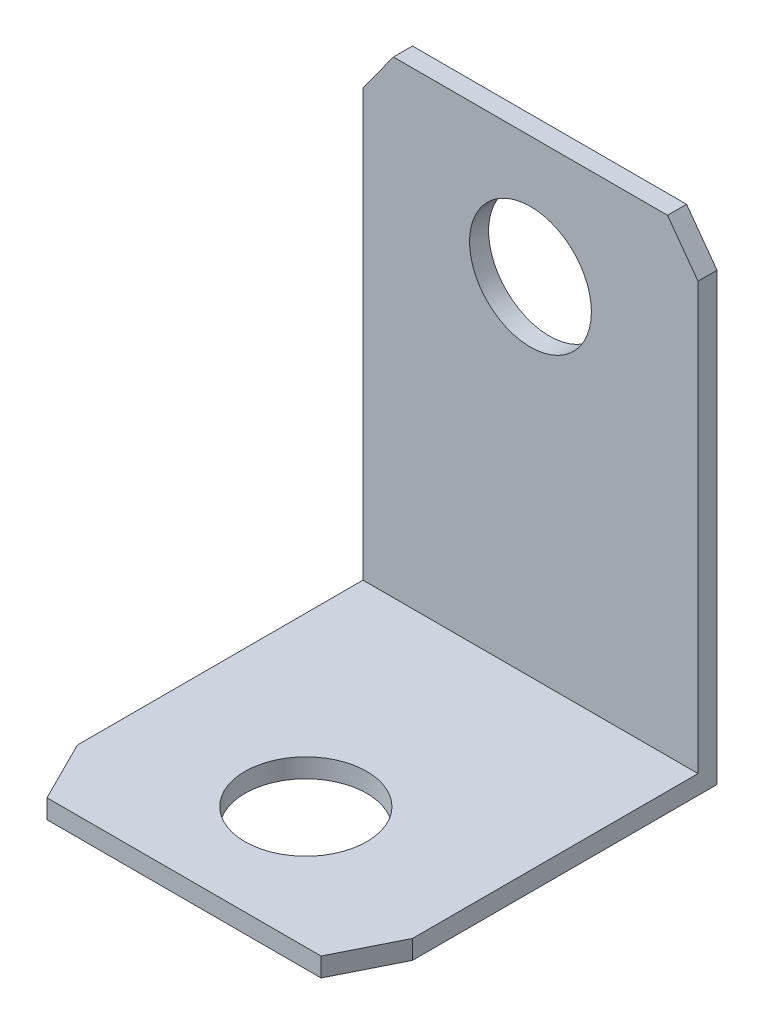
ISO-10303-21;
HEADER;
FILE_DESCRIPTION(('STEP AP214'),'2;1');
FILE_NAME('part.step','',(''),(''),'','','');
FILE_SCHEMA(('AUTOMOTIVE_DESIGN { 1 0 10303 214 1 1 1 1 }'));
ENDSEC;
DATA;
#1=APPLICATION_CONTEXT('core data for automotive mechanical design processes');
#2=APPLICATION_PROTOCOL_DEFINITION('international standard','automotive_design',2000,#1);
#3=PRODUCT_CONTEXT('',#1,'mechanical');
#4=PRODUCT('Part','Part','',(#3));
#5=PRODUCT_RELATED_PRODUCT_CATEGORY('part','',(#4));
#6=PRODUCT_DEFINITION_FORMATION('','',#4);
#7=PRODUCT_DEFINITION_CONTEXT('part definition',#1,'design');
#8=PRODUCT_DEFINITION('design','',#6,#7);
#9=PRODUCT_DEFINITION_SHAPE('','',#8);
#10=(LENGTH_UNIT() NAMED_UNIT(*) SI_UNIT(.MILLI.,.METRE.));
#11=(NAMED_UNIT(*) PLANE_ANGLE_UNIT() SI_UNIT($,.RADIAN.));
#12=(NAMED_UNIT(*) SI_UNIT($,.STERADIAN.) SOLID_ANGLE_UNIT());
#13=UNCERTAINTY_MEASURE_WITH_UNIT(LENGTH_MEASURE(1.E-05),#10,'distance_accuracy_value','');
#14=(GEOMETRIC_REPRESENTATION_CONTEXT(3) GLOBAL_UNCERTAINTY_ASSIGNED_CONTEXT((#13)) GLOBAL_UNIT_ASSIGNED_CONTEXT((#10,
#11,#12)) REPRESENTATION_CONTEXT('',''));
#15=CARTESIAN_POINT('',(0.,0.,0.));
#16=DIRECTION('',(0.,0.,1.));
#17=DIRECTION('',(1.,0.,0.));
#18=AXIS2_PLACEMENT_3D('',#15,#16,#17);
#19=CARTESIAN_POINT('',(0.,1.984375,0.));
#20=DIRECTION('',(0.,-1.,0.));
#21=DIRECTION('',(0.,0.,-1.));
#22=AXIS2_PLACEMENT_3D('',#19,#20,#21);
#23=PLANE('',#22);
#24=CARTESIAN_POINT('',(17.4625,1.984375,25.4));
#25=DIRECTION('',(0.,1.,0.));
#26=DIRECTION('',(0.,0.,1.));
#27=AXIS2_PLACEMENT_3D('',#24,#25,#26);
#28=CIRCLE('',#27,6.35);
#29=CARTESIAN_POINT('',(17.4625,1.984375,31.75));
#30=VERTEX_POINT('',#29);
#31=EDGE_CURVE('E189',#30,#30,#28,.T.);
#32=ORIENTED_EDGE('',*,*,#31,.F.);
#33=EDGE_LOOP('',(#32));
#34=FACE_BOUND('',#33,.T.);
#35=DIRECTION('',(1.,0.,0.));
#36=VECTOR('',#35,1.);
#37=CARTESIAN_POINT('',(34.925,1.984375,1.984375));
#38=LINE('',#37,#36);
#39=CARTESIAN_POINT('',(0.,1.984375,1.984375));
#40=VERTEX_POINT('',#39);
#41=CARTESIAN_POINT('',(34.925,1.984375,1.984375));
#42=VERTEX_POINT('',#41);
#43=EDGE_CURVE('E59',#40,#42,#38,.T.);
#44=ORIENTED_EDGE('',*,*,#43,.F.);
#45=DIRECTION('',(0.,0.,1.));
#46=VECTOR('',#45,1.);
#47=CARTESIAN_POINT('',(0.,1.984375,31.75));
#48=LINE('',#47,#46);
#49=CARTESIAN_POINT('',(0.,1.984375,31.75));
#50=VERTEX_POINT('',#49);
#51=EDGE_CURVE('E98',#40,#50,#48,.T.);
#52=ORIENTED_EDGE('',*,*,#51,.T.);
#53=DIRECTION('',(0.447213595499958,0.,0.894427190999916));
#54=VECTOR('',#53,1.);
#55=CARTESIAN_POINT('',(3.175,1.984375,38.1));
#56=LINE('',#55,#54);
#57=CARTESIAN_POINT('',(3.175,1.984375,38.1));
#58=VERTEX_POINT('',#57);
#59=EDGE_CURVE('E199',#50,#58,#56,.T.);
#60=ORIENTED_EDGE('',*,*,#59,.T.);
#61=DIRECTION('',(1.,0.,0.));
#62=VECTOR('',#61,1.);
#63=CARTESIAN_POINT('',(31.75,1.984375,38.1));
#64=LINE('',#63,#62);
#65=CARTESIAN_POINT('',(31.75,1.984375,38.1));
#66=VERTEX_POINT('',#65);
#67=EDGE_CURVE('E202',#58,#66,#64,.T.);
#68=ORIENTED_EDGE('',*,*,#67,.T.);
#69=DIRECTION('',(0.447213595499958,0.,-0.894427190999916));
#70=VECTOR('',#69,1.);
#71=CARTESIAN_POINT('',(34.925,1.984375,31.75));
#72=LINE('',#71,#70);
#73=CARTESIAN_POINT('',(34.925,1.984375,31.75));
#74=VERTEX_POINT('',#73);
#75=EDGE_CURVE('E66',#66,#74,#72,.T.);
#76=ORIENTED_EDGE('',*,*,#75,.T.);
#77=DIRECTION('',(0.,0.,-1.));
#78=VECTOR('',#77,1.);
#79=CARTESIAN_POINT('',(34.925,1.984375,0.));
#80=LINE('',#79,#78);
#81=EDGE_CURVE('E125',#74,#42,#80,.T.);
#82=ORIENTED_EDGE('',*,*,#81,.T.);
#83=EDGE_LOOP('',(#44,#52,#60,#68,#76,#82));
#84=FACE_BOUND('',#83,.T.);
#85=ADVANCED_FACE('F43',(#34,#84),#23,.F.);
#86=CARTESIAN_POINT('',(0.,0.,0.));
#87=DIRECTION('',(0.,-1.,0.));
#88=DIRECTION('',(0.,0.,-1.));
#89=AXIS2_PLACEMENT_3D('',#86,#87,#88);
#90=PLANE('',#89);
#91=DIRECTION('',(0.,0.,1.));
#92=VECTOR('',#91,1.);
#93=CARTESIAN_POINT('',(0.,0.,31.75));
#94=LINE('',#93,#92);
#95=CARTESIAN_POINT('',(0.,0.,0.));
#96=VERTEX_POINT('',#95);
#97=CARTESIAN_POINT('',(0.,0.,31.75));
#98=VERTEX_POINT('',#97);
#99=EDGE_CURVE('E193',#96,#98,#94,.T.);
#100=ORIENTED_EDGE('',*,*,#99,.F.);
#101=DIRECTION('',(-1.,0.,0.));
#102=VECTOR('',#101,1.);
#103=CARTESIAN_POINT('',(0.,0.,0.));
#104=LINE('',#103,#102);
#105=CARTESIAN_POINT('',(34.925,0.,0.));
#106=VERTEX_POINT('',#105);
#107=EDGE_CURVE('E94',#106,#96,#104,.T.);
#108=ORIENTED_EDGE('',*,*,#107,.F.);
#109=DIRECTION('',(0.,0.,-1.));
#110=VECTOR('',#109,1.);
#111=CARTESIAN_POINT('',(34.925,0.,0.));
#112=LINE('',#111,#110);
#113=CARTESIAN_POINT('',(34.925,0.,31.75));
#114=VERTEX_POINT('',#113);
#115=EDGE_CURVE('E219',#114,#106,#112,.T.);
#116=ORIENTED_EDGE('',*,*,#115,.F.);
#117=DIRECTION('',(0.447213595499958,0.,-0.894427190999916));
#118=VECTOR('',#117,1.);
#119=CARTESIAN_POINT('',(34.925,0.,31.75));
#120=LINE('',#119,#118);
#121=CARTESIAN_POINT('',(31.75,0.,38.1));
#122=VERTEX_POINT('',#121);
#123=EDGE_CURVE('E216',#122,#114,#120,.T.);
#124=ORIENTED_EDGE('',*,*,#123,.F.);
#125=DIRECTION('',(1.,0.,0.));
#126=VECTOR('',#125,1.);
#127=CARTESIAN_POINT('',(31.75,0.,38.1));
#128=LINE('',#127,#126);
#129=CARTESIAN_POINT('',(3.175,0.,38.1));
#130=VERTEX_POINT('',#129);
#131=EDGE_CURVE('E213',#130,#122,#128,.T.);
#132=ORIENTED_EDGE('',*,*,#131,.F.);
#133=DIRECTION('',(0.447213595499958,0.,0.894427190999916));
#134=VECTOR('',#133,1.);
#135=CARTESIAN_POINT('',(3.175,0.,38.1));
#136=LINE('',#135,#134);
#137=EDGE_CURVE('E210',#98,#130,#136,.T.);
#138=ORIENTED_EDGE('',*,*,#137,.F.);
#139=EDGE_LOOP('',(#100,#108,#116,#124,#132,#138));
#140=FACE_BOUND('',#139,.T.);
#141=CARTESIAN_POINT('',(17.4625,0.,25.4));
#142=DIRECTION('',(0.,1.,0.));
#143=DIRECTION('',(0.,0.,1.));
#144=AXIS2_PLACEMENT_3D('',#141,#142,#143);
#145=CIRCLE('',#144,6.35);
#146=CARTESIAN_POINT('',(17.4625,0.,31.75));
#147=VERTEX_POINT('',#146);
#148=EDGE_CURVE('E188',#147,#147,#145,.T.);
#149=ORIENTED_EDGE('',*,*,#148,.T.);
#150=EDGE_LOOP('',(#149));
#151=FACE_BOUND('',#150,.T.);
#152=ADVANCED_FACE('F247',(#140,#151),#90,.T.);
#153=CARTESIAN_POINT('',(0.,1.984375,31.75));
#154=DIRECTION('',(1.,0.,0.));
#155=DIRECTION('',(0.,0.,-1.));
#156=AXIS2_PLACEMENT_3D('',#153,#154,#155);
#157=PLANE('',#156);
#158=ORIENTED_EDGE('',*,*,#99,.T.);
#159=DIRECTION('',(0.,-1.,0.));
#160=VECTOR('',#159,1.);
#161=CARTESIAN_POINT('',(0.,1.984375,31.75));
#162=LINE('',#161,#160);
#163=EDGE_CURVE('E11',#50,#98,#162,.T.);
#164=ORIENTED_EDGE('',*,*,#163,.F.);
#165=ORIENTED_EDGE('',*,*,#51,.F.);
#166=DIRECTION('',(0.,-1.,0.));
#167=VECTOR('',#166,1.);
#168=CARTESIAN_POINT('',(0.,1.984375,1.984375));
#169=LINE('',#168,#167);
#170=CARTESIAN_POINT('',(0.,46.434375,1.984375));
#171=VERTEX_POINT('',#170);
#172=EDGE_CURVE('E146',#171,#40,#169,.T.);
#173=ORIENTED_EDGE('',*,*,#172,.F.);
#174=DIRECTION('',(0.,0.,-1.));
#175=VECTOR('',#174,1.);
#176=CARTESIAN_POINT('',(0.,46.434375,1.984375));
#177=LINE('',#176,#175);
#178=CARTESIAN_POINT('',(0.,46.434375,0.));
#179=VERTEX_POINT('',#178);
#180=EDGE_CURVE('E168',#171,#179,#177,.T.);
#181=ORIENTED_EDGE('',*,*,#180,.T.);
#182=DIRECTION('',(0.,-1.,0.));
#183=VECTOR('',#182,1.);
#184=CARTESIAN_POINT('',(0.,1.984375,0.));
#185=LINE('',#184,#183);
#186=EDGE_CURVE('E130',#179,#96,#185,.T.);
#187=ORIENTED_EDGE('',*,*,#186,.T.);
#188=EDGE_LOOP('',(#158,#164,#165,#173,#181,#187));
#189=FACE_BOUND('',#188,.T.);
#190=ADVANCED_FACE('F45',(#189),#157,.F.);
#191=CARTESIAN_POINT('',(3.175,1.984375,38.1));
#192=DIRECTION('',(0.894427190999916,0.,-0.447213595499958));
#193=DIRECTION('',(-0.447213595499958,0.,-0.894427190999916));
#194=AXIS2_PLACEMENT_3D('',#191,#192,#193);
#195=PLANE('',#194);
#196=ORIENTED_EDGE('',*,*,#137,.T.);
#197=DIRECTION('',(0.,-1.,0.));
#198=VECTOR('',#197,1.);
#199=CARTESIAN_POINT('',(3.175,1.984375,38.1));
#200=LINE('',#199,#198);
#201=EDGE_CURVE('E52',#58,#130,#200,.T.);
#202=ORIENTED_EDGE('',*,*,#201,.F.);
#203=ORIENTED_EDGE('',*,*,#59,.F.);
#204=ORIENTED_EDGE('',*,*,#163,.T.);
#205=EDGE_LOOP('',(#196,#202,#203,#204));
#206=FACE_BOUND('',#205,.T.);
#207=ADVANCED_FACE('F296',(#206),#195,.F.);
#208=CARTESIAN_POINT('',(31.75,1.984375,38.1));
#209=DIRECTION('',(0.,0.,-1.));
#210=DIRECTION('',(-1.,0.,0.));
#211=AXIS2_PLACEMENT_3D('',#208,#209,#210);
#212=PLANE('',#211);
#213=ORIENTED_EDGE('',*,*,#131,.T.);
#214=DIRECTION('',(0.,-1.,0.));
#215=VECTOR('',#214,1.);
#216=CARTESIAN_POINT('',(31.75,1.984375,38.1));
#217=LINE('',#216,#215);
#218=EDGE_CURVE('E232',#66,#122,#217,.T.);
#219=ORIENTED_EDGE('',*,*,#218,.F.);
#220=ORIENTED_EDGE('',*,*,#67,.F.);
#221=ORIENTED_EDGE('',*,*,#201,.T.);
#222=EDGE_LOOP('',(#213,#219,#220,#221));
#223=FACE_BOUND('',#222,.T.);
#224=ADVANCED_FACE('F241',(#223),#212,.F.);
#225=CARTESIAN_POINT('',(34.925,1.984375,31.75));
#226=DIRECTION('',(-0.894427190999916,0.,-0.447213595499958));
#227=DIRECTION('',(-0.447213595499958,0.,0.894427190999916));
#228=AXIS2_PLACEMENT_3D('',#225,#226,#227);
#229=PLANE('',#228);
#230=ORIENTED_EDGE('',*,*,#123,.T.);
#231=DIRECTION('',(0.,-1.,0.));
#232=VECTOR('',#231,1.);
#233=CARTESIAN_POINT('',(34.925,1.984375,31.75));
#234=LINE('',#233,#232);
#235=EDGE_CURVE('E229',#74,#114,#234,.T.);
#236=ORIENTED_EDGE('',*,*,#235,.F.);
#237=ORIENTED_EDGE('',*,*,#75,.F.);
#238=ORIENTED_EDGE('',*,*,#218,.T.);
#239=EDGE_LOOP('',(#230,#236,#237,#238));
#240=FACE_BOUND('',#239,.T.);
#241=ADVANCED_FACE('F251',(#240),#229,.F.);
#242=CARTESIAN_POINT('',(34.925,1.984375,0.));
#243=DIRECTION('',(-1.,0.,0.));
#244=DIRECTION('',(0.,0.,1.));
#245=AXIS2_PLACEMENT_3D('',#242,#243,#244);
#246=PLANE('',#245);
#247=ORIENTED_EDGE('',*,*,#115,.T.);
#248=DIRECTION('',(0.,-1.,0.));
#249=VECTOR('',#248,1.);
#250=CARTESIAN_POINT('',(34.925,1.984375,0.));
#251=LINE('',#250,#249);
#252=CARTESIAN_POINT('',(34.925,46.434375,0.));
#253=VERTEX_POINT('',#252);
#254=EDGE_CURVE('E226',#253,#106,#251,.T.);
#255=ORIENTED_EDGE('',*,*,#254,.F.);
#256=DIRECTION('',(0.,0.,-1.));
#257=VECTOR('',#256,1.);
#258=CARTESIAN_POINT('',(34.925,46.434375,1.984375));
#259=LINE('',#258,#257);
#260=CARTESIAN_POINT('',(34.925,46.434375,1.984375));
#261=VERTEX_POINT('',#260);
#262=EDGE_CURVE('E136',#261,#253,#259,.T.);
#263=ORIENTED_EDGE('',*,*,#262,.F.);
#264=DIRECTION('',(0.,1.,0.));
#265=VECTOR('',#264,1.);
#266=CARTESIAN_POINT('',(34.925,46.434375,1.984375));
#267=LINE('',#266,#265);
#268=EDGE_CURVE('E133',#42,#261,#267,.T.);
#269=ORIENTED_EDGE('',*,*,#268,.F.);
#270=ORIENTED_EDGE('',*,*,#81,.F.);
#271=ORIENTED_EDGE('',*,*,#235,.T.);
#272=EDGE_LOOP('',(#247,#255,#263,#269,#270,#271));
#273=FACE_BOUND('',#272,.T.);
#274=ADVANCED_FACE('F134',(#273),#246,.F.);
#275=CARTESIAN_POINT('',(0.,1.984375,0.));
#276=DIRECTION('',(0.,0.,1.));
#277=DIRECTION('',(1.,0.,0.));
#278=AXIS2_PLACEMENT_3D('',#275,#276,#277);
#279=PLANE('',#278);
#280=ORIENTED_EDGE('',*,*,#107,.T.);
#281=ORIENTED_EDGE('',*,*,#186,.F.);
#282=DIRECTION('',(-0.588171697675047,-0.808736084303188,0.));
#283=VECTOR('',#282,1.);
#284=CARTESIAN_POINT('',(0.,46.434375,0.));
#285=LINE('',#284,#283);
#286=CARTESIAN_POINT('',(3.175,50.8,0.));
#287=VERTEX_POINT('',#286);
#288=EDGE_CURVE('E148',#287,#179,#285,.T.);
#289=ORIENTED_EDGE('',*,*,#288,.F.);
#290=DIRECTION('',(-1.,0.,0.));
#291=VECTOR('',#290,1.);
#292=CARTESIAN_POINT('',(3.175,50.8,0.));
#293=LINE('',#292,#291);
#294=CARTESIAN_POINT('',(31.75,50.8,0.));
#295=VERTEX_POINT('',#294);
#296=EDGE_CURVE('E152',#295,#287,#293,.T.);
#297=ORIENTED_EDGE('',*,*,#296,.F.);
#298=DIRECTION('',(-0.588171697675046,0.808736084303189,0.));
#299=VECTOR('',#298,1.);
#300=CARTESIAN_POINT('',(31.75,50.8,0.));
#301=LINE('',#300,#299);
#302=EDGE_CURVE('E169',#253,#295,#301,.T.);
#303=ORIENTED_EDGE('',*,*,#302,.F.);
#304=ORIENTED_EDGE('',*,*,#254,.T.);
#305=EDGE_LOOP('',(#280,#281,#289,#297,#303,#304));
#306=FACE_BOUND('',#305,.T.);
#307=CARTESIAN_POINT('',(17.4625,38.1,0.));
#308=DIRECTION('',(0.,0.,1.));
#309=DIRECTION('',(1.,0.,0.));
#310=AXIS2_PLACEMENT_3D('',#307,#308,#309);
#311=CIRCLE('',#310,6.35);
#312=CARTESIAN_POINT('',(23.8125,38.1,0.));
#313=VERTEX_POINT('',#312);
#314=EDGE_CURVE('E155',#313,#313,#311,.T.);
#315=ORIENTED_EDGE('',*,*,#314,.T.);
#316=EDGE_LOOP('',(#315));
#317=FACE_BOUND('',#316,.T.);
#318=ADVANCED_FACE('F253',(#306,#317),#279,.F.);
#319=CARTESIAN_POINT('',(17.4625,1.984375,25.4));
#320=DIRECTION('',(0.,-1.,0.));
#321=DIRECTION('',(0.,0.,-1.));
#322=AXIS2_PLACEMENT_3D('',#319,#320,#321);
#323=CYLINDRICAL_SURFACE('',#322,6.35);
#324=ORIENTED_EDGE('',*,*,#31,.T.);
#325=EDGE_LOOP('',(#324));
#326=FACE_BOUND('',#325,.T.);
#327=ORIENTED_EDGE('',*,*,#148,.F.);
#328=EDGE_LOOP('',(#327));
#329=FACE_BOUND('',#328,.T.);
#330=ADVANCED_FACE('F277',(#326,#329),#323,.F.);
#331=CARTESIAN_POINT('',(0.,0.,1.984375));
#332=DIRECTION('',(0.,0.,-1.));
#333=DIRECTION('',(-1.,0.,0.));
#334=AXIS2_PLACEMENT_3D('',#331,#332,#333);
#335=PLANE('',#334);
#336=ORIENTED_EDGE('',*,*,#43,.T.);
#337=ORIENTED_EDGE('',*,*,#268,.T.);
#338=DIRECTION('',(-0.588171697675046,0.808736084303189,0.));
#339=VECTOR('',#338,1.);
#340=CARTESIAN_POINT('',(31.75,50.8,1.984375));
#341=LINE('',#340,#339);
#342=CARTESIAN_POINT('',(31.75,50.8,1.984375));
#343=VERTEX_POINT('',#342);
#344=EDGE_CURVE('E140',#261,#343,#341,.T.);
#345=ORIENTED_EDGE('',*,*,#344,.T.);
#346=DIRECTION('',(-1.,0.,0.));
#347=VECTOR('',#346,1.);
#348=CARTESIAN_POINT('',(3.175,50.8,1.984375));
#349=LINE('',#348,#347);
#350=CARTESIAN_POINT('',(3.175,50.8,1.984375));
#351=VERTEX_POINT('',#350);
#352=EDGE_CURVE('E160',#343,#351,#349,.T.);
#353=ORIENTED_EDGE('',*,*,#352,.T.);
#354=DIRECTION('',(-0.588171697675047,-0.808736084303188,0.));
#355=VECTOR('',#354,1.);
#356=CARTESIAN_POINT('',(0.,46.434375,1.984375));
#357=LINE('',#356,#355);
#358=EDGE_CURVE('E163',#351,#171,#357,.T.);
#359=ORIENTED_EDGE('',*,*,#358,.T.);
#360=ORIENTED_EDGE('',*,*,#172,.T.);
#361=EDGE_LOOP('',(#336,#337,#345,#353,#359,#360));
#362=FACE_BOUND('',#361,.T.);
#363=CARTESIAN_POINT('',(17.4625,38.1,1.984375));
#364=DIRECTION('',(0.,0.,1.));
#365=DIRECTION('',(1.,0.,0.));
#366=AXIS2_PLACEMENT_3D('',#363,#364,#365);
#367=CIRCLE('',#366,6.35);
#368=CARTESIAN_POINT('',(23.8125,38.1,1.984375));
#369=VERTEX_POINT('',#368);
#370=EDGE_CURVE('E172',#369,#369,#367,.T.);
#371=ORIENTED_EDGE('',*,*,#370,.F.);
#372=EDGE_LOOP('',(#371));
#373=FACE_BOUND('',#372,.T.);
#374=ADVANCED_FACE('F143',(#362,#373),#335,.F.);
#375=CARTESIAN_POINT('',(31.75,50.8,1.984375));
#376=DIRECTION('',(-0.808736084303189,-0.588171697675046,0.));
#377=DIRECTION('',(0.588171697675046,-0.808736084303189,0.));
#378=AXIS2_PLACEMENT_3D('',#375,#376,#377);
#379=PLANE('',#378);
#380=ORIENTED_EDGE('',*,*,#302,.T.);
#381=DIRECTION('',(0.,0.,-1.));
#382=VECTOR('',#381,1.);
#383=CARTESIAN_POINT('',(31.75,50.8,1.984375));
#384=LINE('',#383,#382);
#385=EDGE_CURVE('E182',#343,#295,#384,.T.);
#386=ORIENTED_EDGE('',*,*,#385,.F.);
#387=ORIENTED_EDGE('',*,*,#344,.F.);
#388=ORIENTED_EDGE('',*,*,#262,.T.);
#389=EDGE_LOOP('',(#380,#386,#387,#388));
#390=FACE_BOUND('',#389,.T.);
#391=ADVANCED_FACE('F269',(#390),#379,.F.);
#392=CARTESIAN_POINT('',(3.175,50.8,1.984375));
#393=DIRECTION('',(0.,-1.,0.));
#394=DIRECTION('',(0.,0.,-1.));
#395=AXIS2_PLACEMENT_3D('',#392,#393,#394);
#396=PLANE('',#395);
#397=ORIENTED_EDGE('',*,*,#296,.T.);
#398=DIRECTION('',(0.,0.,-1.));
#399=VECTOR('',#398,1.);
#400=CARTESIAN_POINT('',(3.175,50.8,1.984375));
#401=LINE('',#400,#399);
#402=EDGE_CURVE('E178',#351,#287,#401,.T.);
#403=ORIENTED_EDGE('',*,*,#402,.F.);
#404=ORIENTED_EDGE('',*,*,#352,.F.);
#405=ORIENTED_EDGE('',*,*,#385,.T.);
#406=EDGE_LOOP('',(#397,#403,#404,#405));
#407=FACE_BOUND('',#406,.T.);
#408=ADVANCED_FACE('F266',(#407),#396,.F.);
#409=CARTESIAN_POINT('',(0.,46.434375,1.984375));
#410=DIRECTION('',(0.808736084303188,-0.588171697675046,0.));
#411=DIRECTION('',(0.588171697675047,0.808736084303188,0.));
#412=AXIS2_PLACEMENT_3D('',#409,#410,#411);
#413=PLANE('',#412);
#414=ORIENTED_EDGE('',*,*,#288,.T.);
#415=ORIENTED_EDGE('',*,*,#180,.F.);
#416=ORIENTED_EDGE('',*,*,#358,.F.);
#417=ORIENTED_EDGE('',*,*,#402,.T.);
#418=EDGE_LOOP('',(#414,#415,#416,#417));
#419=FACE_BOUND('',#418,.T.);
#420=ADVANCED_FACE('F261',(#419),#413,.F.);
#421=CARTESIAN_POINT('',(17.4625,38.1,1.984375));
#422=DIRECTION('',(0.,0.,-1.));
#423=DIRECTION('',(-1.,0.,0.));
#424=AXIS2_PLACEMENT_3D('',#421,#422,#423);
#425=CYLINDRICAL_SURFACE('',#424,6.35);
#426=ORIENTED_EDGE('',*,*,#370,.T.);
#427=EDGE_LOOP('',(#426));
#428=FACE_BOUND('',#427,.T.);
#429=ORIENTED_EDGE('',*,*,#314,.F.);
#430=EDGE_LOOP('',(#429));
#431=FACE_BOUND('',#430,.T.);
#432=ADVANCED_FACE('F375',(#428,#431),#425,.F.);
#433=CLOSED_SHELL('',(#85,#152,#190,#207,#224,#241,#274,#318,#330,#374,#391,#408,#420,#432));
#434=MANIFOLD_SOLID_BREP('B2',#433);
#435=ADVANCED_BREP_SHAPE_REPRESENTATION('',(#18,#434),#14);
#436=SHAPE_DEFINITION_REPRESENTATION(#9,#435);
ENDSEC;
END-ISO-10303-21;
